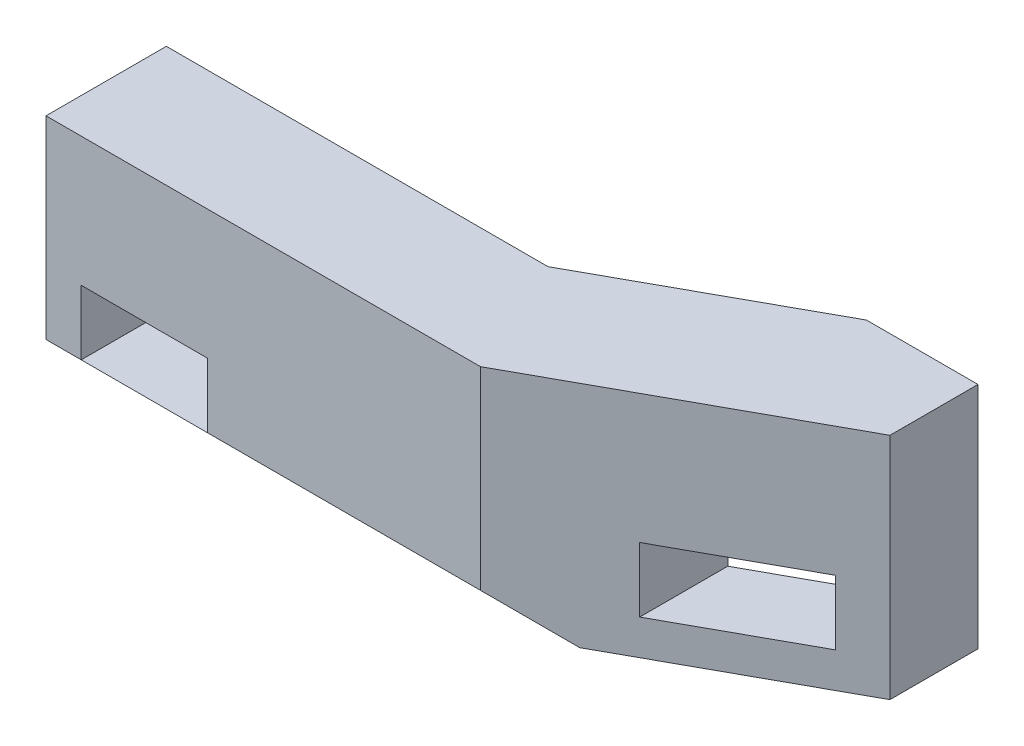
ISO-10303-21;
HEADER;
FILE_DESCRIPTION(('STEP AP214'),'2;1');
FILE_NAME('part.step','',(''),(''),'','','');
FILE_SCHEMA(('AUTOMOTIVE_DESIGN { 1 0 10303 214 1 1 1 1 }'));
ENDSEC;
DATA;
#1=APPLICATION_CONTEXT('core data for automotive mechanical design processes');
#2=APPLICATION_PROTOCOL_DEFINITION('international standard','automotive_design',2000,#1);
#3=PRODUCT_CONTEXT('',#1,'mechanical');
#4=PRODUCT('Part','Part','',(#3));
#5=PRODUCT_RELATED_PRODUCT_CATEGORY('part','',(#4));
#6=PRODUCT_DEFINITION_FORMATION('','',#4);
#7=PRODUCT_DEFINITION_CONTEXT('part definition',#1,'design');
#8=PRODUCT_DEFINITION('design','',#6,#7);
#9=PRODUCT_DEFINITION_SHAPE('','',#8);
#10=(LENGTH_UNIT() NAMED_UNIT(*) SI_UNIT(.MILLI.,.METRE.));
#11=(NAMED_UNIT(*) PLANE_ANGLE_UNIT() SI_UNIT($,.RADIAN.));
#12=(NAMED_UNIT(*) SI_UNIT($,.STERADIAN.) SOLID_ANGLE_UNIT());
#13=UNCERTAINTY_MEASURE_WITH_UNIT(LENGTH_MEASURE(1.E-05),#10,'distance_accuracy_value','');
#14=(GEOMETRIC_REPRESENTATION_CONTEXT(3) GLOBAL_UNCERTAINTY_ASSIGNED_CONTEXT((#13)) GLOBAL_UNIT_ASSIGNED_CONTEXT((#10,
#11,#12)) REPRESENTATION_CONTEXT('',''));
#15=CARTESIAN_POINT('',(0.,0.,0.));
#16=DIRECTION('',(0.,0.,1.));
#17=DIRECTION('',(1.,0.,0.));
#18=AXIS2_PLACEMENT_3D('',#15,#16,#17);
#19=CARTESIAN_POINT('',(0.,3.9,-5.89906103286385));
#20=DIRECTION('',(0.,0.,-1.));
#21=DIRECTION('',(-1.,0.,0.));
#22=AXIS2_PLACEMENT_3D('',#19,#20,#21);
#23=PLANE('',#22);
#24=DIRECTION('',(1.,0.,0.));
#25=VECTOR('',#24,1.);
#26=CARTESIAN_POINT('',(13.4996205473604,2.7,-5.89906103286385));
#27=LINE('',#26,#25);
#28=CARTESIAN_POINT('',(13.4996205473604,2.7,-5.89906103286385));
#29=VERTEX_POINT('',#28);
#30=CARTESIAN_POINT('',(17.3,2.7,-5.89906103286385));
#31=VERTEX_POINT('',#30);
#32=EDGE_CURVE('E233',#29,#31,#27,.T.);
#33=ORIENTED_EDGE('',*,*,#32,.F.);
#34=DIRECTION('',(0.,-1.,0.));
#35=VECTOR('',#34,1.);
#36=CARTESIAN_POINT('',(13.4996205473604,3.9,-5.89906103286385));
#37=LINE('',#36,#35);
#38=CARTESIAN_POINT('',(13.4996205473604,3.9,-5.89906103286385));
#39=VERTEX_POINT('',#38);
#40=EDGE_CURVE('E316',#39,#29,#37,.T.);
#41=ORIENTED_EDGE('',*,*,#40,.F.);
#42=DIRECTION('',(1.,0.,0.));
#43=VECTOR('',#42,1.);
#44=CARTESIAN_POINT('',(0.,3.9,-5.89906103286385));
#45=LINE('',#44,#43);
#46=CARTESIAN_POINT('',(17.3,3.9,-5.89906103286385));
#47=VERTEX_POINT('',#46);
#48=EDGE_CURVE('E255',#39,#47,#45,.T.);
#49=ORIENTED_EDGE('',*,*,#48,.T.);
#50=DIRECTION('',(0.,-1.,0.));
#51=VECTOR('',#50,1.);
#52=CARTESIAN_POINT('',(17.3,3.9,-5.89906103286385));
#53=LINE('',#52,#51);
#54=EDGE_CURVE('E281',#47,#31,#53,.T.);
#55=ORIENTED_EDGE('',*,*,#54,.T.);
#56=EDGE_LOOP('',(#33,#41,#49,#55));
#57=FACE_BOUND('',#56,.T.);
#58=ADVANCED_FACE('F47',(#57),#23,.T.);
#59=CARTESIAN_POINT('',(0.643602183385777,3.9,1.17040780301716));
#60=DIRECTION('',(-0.481848560622123,0.,-0.876254509047678));
#61=DIRECTION('',(-0.876254509047679,0.,0.481848560622123));
#62=AXIS2_PLACEMENT_3D('',#59,#60,#61);
#63=PLANE('',#62);
#64=DIRECTION('',(0.876254509047678,0.,-0.481848560622123));
#65=VECTOR('',#64,1.);
#66=CARTESIAN_POINT('',(6.5,2.7,-2.05));
#67=LINE('',#66,#65);
#68=CARTESIAN_POINT('',(6.5,2.7,-2.05));
#69=VERTEX_POINT('',#68);
#70=EDGE_CURVE('E238',#69,#29,#67,.T.);
#71=ORIENTED_EDGE('',*,*,#70,.F.);
#72=DIRECTION('',(0.,-1.,0.));
#73=VECTOR('',#72,1.);
#74=CARTESIAN_POINT('',(6.5,3.9,-2.05));
#75=LINE('',#74,#73);
#76=CARTESIAN_POINT('',(6.5,3.9,-2.05));
#77=VERTEX_POINT('',#76);
#78=EDGE_CURVE('E312',#77,#69,#75,.T.);
#79=ORIENTED_EDGE('',*,*,#78,.F.);
#80=DIRECTION('',(0.876254509047678,0.,-0.481848560622123));
#81=VECTOR('',#80,1.);
#82=CARTESIAN_POINT('',(0.643602183385777,3.9,1.17040780301716));
#83=LINE('',#82,#81);
#84=EDGE_CURVE('E259',#77,#39,#83,.T.);
#85=ORIENTED_EDGE('',*,*,#84,.T.);
#86=ORIENTED_EDGE('',*,*,#40,.T.);
#87=EDGE_LOOP('',(#71,#79,#85,#86));
#88=FACE_BOUND('',#87,.T.);
#89=ADVANCED_FACE('F429',(#88),#63,.T.);
#90=CARTESIAN_POINT('',(0.,3.9,-2.05));
#91=DIRECTION('',(0.,0.,-1.));
#92=DIRECTION('',(-1.,0.,0.));
#93=AXIS2_PLACEMENT_3D('',#90,#91,#92);
#94=PLANE('',#93);
#95=DIRECTION('',(0.,-1.,0.));
#96=VECTOR('',#95,1.);
#97=CARTESIAN_POINT('',(-0.999999999999999,3.9,-2.05));
#98=LINE('',#97,#96);
#99=CARTESIAN_POINT('',(-0.999999999999998,-0.5,-2.05));
#100=VERTEX_POINT('',#99);
#101=CARTESIAN_POINT('',(-0.999999999999998,-2.7,-2.05));
#102=VERTEX_POINT('',#101);
#103=EDGE_CURVE('E219',#100,#102,#98,.T.);
#104=ORIENTED_EDGE('',*,*,#103,.F.);
#105=DIRECTION('',(1.,0.,0.));
#106=VECTOR('',#105,1.);
#107=CARTESIAN_POINT('',(0.,-0.5,-2.05));
#108=LINE('',#107,#106);
#109=CARTESIAN_POINT('',(-5.3,-0.5,-2.05));
#110=VERTEX_POINT('',#109);
#111=EDGE_CURVE('E209',#110,#100,#108,.T.);
#112=ORIENTED_EDGE('',*,*,#111,.F.);
#113=DIRECTION('',(0.,1.,0.));
#114=VECTOR('',#113,1.);
#115=CARTESIAN_POINT('',(-5.3,3.9,-2.05));
#116=LINE('',#115,#114);
#117=CARTESIAN_POINT('',(-5.3,-2.7,-2.05));
#118=VERTEX_POINT('',#117);
#119=EDGE_CURVE('E212',#118,#110,#116,.T.);
#120=ORIENTED_EDGE('',*,*,#119,.F.);
#121=DIRECTION('',(-1.,0.,0.));
#122=VECTOR('',#121,1.);
#123=CARTESIAN_POINT('',(0.,-2.7,-2.05));
#124=LINE('',#123,#122);
#125=EDGE_CURVE('E216',#102,#118,#124,.T.);
#126=ORIENTED_EDGE('',*,*,#125,.F.);
#127=EDGE_LOOP('',(#104,#112,#120,#126));
#128=FACE_BOUND('',#127,.T.);
#129=DIRECTION('',(1.,0.,0.));
#130=VECTOR('',#129,1.);
#131=CARTESIAN_POINT('',(0.,-3.9,-2.05));
#132=LINE('',#131,#130);
#133=CARTESIAN_POINT('',(-6.5,-3.9,-2.05));
#134=VERTEX_POINT('',#133);
#135=CARTESIAN_POINT('',(6.5,-3.9,-2.05));
#136=VERTEX_POINT('',#135);
#137=EDGE_CURVE('E254',#134,#136,#132,.T.);
#138=ORIENTED_EDGE('',*,*,#137,.F.);
#139=DIRECTION('',(0.,-1.,0.));
#140=VECTOR('',#139,1.);
#141=CARTESIAN_POINT('',(-6.5,3.9,-2.05));
#142=LINE('',#141,#140);
#143=CARTESIAN_POINT('',(-6.5,3.9,-2.05));
#144=VERTEX_POINT('',#143);
#145=EDGE_CURVE('E308',#144,#134,#142,.T.);
#146=ORIENTED_EDGE('',*,*,#145,.F.);
#147=DIRECTION('',(1.,0.,0.));
#148=VECTOR('',#147,1.);
#149=CARTESIAN_POINT('',(0.,3.9,-2.05));
#150=LINE('',#149,#148);
#151=EDGE_CURVE('E264',#144,#77,#150,.T.);
#152=ORIENTED_EDGE('',*,*,#151,.T.);
#153=ORIENTED_EDGE('',*,*,#78,.T.);
#154=DIRECTION('',(0.,-1.,0.));
#155=VECTOR('',#154,1.);
#156=CARTESIAN_POINT('',(6.5,15.7799497097846,-2.05));
#157=LINE('',#156,#155);
#158=EDGE_CURVE('E241',#69,#136,#157,.T.);
#159=ORIENTED_EDGE('',*,*,#158,.T.);
#160=EDGE_LOOP('',(#138,#146,#152,#153,#159));
#161=FACE_BOUND('',#160,.T.);
#162=ADVANCED_FACE('F422',(#128,#161),#94,.T.);
#163=CARTESIAN_POINT('',(-6.5,3.9,0.));
#164=DIRECTION('',(-1.,0.,0.));
#165=DIRECTION('',(0.,0.,1.));
#166=AXIS2_PLACEMENT_3D('',#163,#164,#165);
#167=PLANE('',#166);
#168=DIRECTION('',(0.,0.,-1.));
#169=VECTOR('',#168,1.);
#170=CARTESIAN_POINT('',(-6.5,-3.9,0.));
#171=LINE('',#170,#169);
#172=CARTESIAN_POINT('',(-6.5,-3.9,0.849999999999993));
#173=VERTEX_POINT('',#172);
#174=EDGE_CURVE('E285',#173,#134,#171,.T.);
#175=ORIENTED_EDGE('',*,*,#174,.F.);
#176=DIRECTION('',(0.,-0.707106781186547,-0.707106781186549));
#177=VECTOR('',#176,1.);
#178=CARTESIAN_POINT('',(-6.5,-0.425000000000008,4.325));
#179=LINE('',#178,#177);
#180=CARTESIAN_POINT('',(-6.5,-2.7,2.05));
#181=VERTEX_POINT('',#180);
#182=EDGE_CURVE('E12',#173,#181,#179,.F.);
#183=ORIENTED_EDGE('',*,*,#182,.T.);
#184=DIRECTION('',(0.,-1.,0.));
#185=VECTOR('',#184,1.);
#186=CARTESIAN_POINT('',(-6.5,3.9,2.05));
#187=LINE('',#186,#185);
#188=CARTESIAN_POINT('',(-6.5,3.9,2.05));
#189=VERTEX_POINT('',#188);
#190=EDGE_CURVE('E304',#189,#181,#187,.T.);
#191=ORIENTED_EDGE('',*,*,#190,.F.);
#192=DIRECTION('',(0.,0.,-1.));
#193=VECTOR('',#192,1.);
#194=CARTESIAN_POINT('',(-6.5,3.9,0.));
#195=LINE('',#194,#193);
#196=EDGE_CURVE('E268',#189,#144,#195,.T.);
#197=ORIENTED_EDGE('',*,*,#196,.T.);
#198=ORIENTED_EDGE('',*,*,#145,.T.);
#199=EDGE_LOOP('',(#175,#183,#191,#197,#198));
#200=FACE_BOUND('',#199,.T.);
#201=ADVANCED_FACE('F419',(#200),#167,.T.);
#202=CARTESIAN_POINT('',(0.,3.9,2.05));
#203=DIRECTION('',(0.,0.,-1.));
#204=DIRECTION('',(-1.,0.,0.));
#205=AXIS2_PLACEMENT_3D('',#202,#203,#204);
#206=PLANE('',#205);
#207=ORIENTED_EDGE('',*,*,#190,.T.);
#208=DIRECTION('',(1.,0.,0.));
#209=VECTOR('',#208,1.);
#210=CARTESIAN_POINT('',(0.,-2.7,2.05));
#211=LINE('',#210,#209);
#212=CARTESIAN_POINT('',(-5.3,-2.7,2.05));
#213=VERTEX_POINT('',#212);
#214=EDGE_CURVE('E351',#181,#213,#211,.T.);
#215=ORIENTED_EDGE('',*,*,#214,.T.);
#216=DIRECTION('',(0.,1.,0.));
#217=VECTOR('',#216,1.);
#218=CARTESIAN_POINT('',(-5.3,3.9,2.05));
#219=LINE('',#218,#217);
#220=CARTESIAN_POINT('',(-5.3,-0.5,2.05));
#221=VERTEX_POINT('',#220);
#222=EDGE_CURVE('E337',#213,#221,#219,.T.);
#223=ORIENTED_EDGE('',*,*,#222,.T.);
#224=DIRECTION('',(1.,0.,0.));
#225=VECTOR('',#224,1.);
#226=CARTESIAN_POINT('',(0.,-0.5,2.05));
#227=LINE('',#226,#225);
#228=CARTESIAN_POINT('',(-0.999999999999998,-0.5,2.05));
#229=VERTEX_POINT('',#228);
#230=EDGE_CURVE('E333',#221,#229,#227,.T.);
#231=ORIENTED_EDGE('',*,*,#230,.T.);
#232=DIRECTION('',(0.,-1.,0.));
#233=VECTOR('',#232,1.);
#234=CARTESIAN_POINT('',(-0.999999999999999,3.9,2.05));
#235=LINE('',#234,#233);
#236=CARTESIAN_POINT('',(-0.999999999999998,-2.7,2.05));
#237=VERTEX_POINT('',#236);
#238=EDGE_CURVE('E344',#229,#237,#235,.T.);
#239=ORIENTED_EDGE('',*,*,#238,.T.);
#240=DIRECTION('',(1.,0.,0.));
#241=VECTOR('',#240,1.);
#242=CARTESIAN_POINT('',(0.,-2.7,2.05));
#243=LINE('',#242,#241);
#244=CARTESIAN_POINT('',(8.3,-2.7,2.05));
#245=VERTEX_POINT('',#244);
#246=EDGE_CURVE('E348',#237,#245,#243,.T.);
#247=ORIENTED_EDGE('',*,*,#246,.T.);
#248=DIRECTION('',(0.,-1.,0.));
#249=VECTOR('',#248,1.);
#250=CARTESIAN_POINT('',(8.3,3.9,2.05));
#251=LINE('',#250,#249);
#252=CARTESIAN_POINT('',(8.3,3.9,2.05));
#253=VERTEX_POINT('',#252);
#254=EDGE_CURVE('E301',#253,#245,#251,.T.);
#255=ORIENTED_EDGE('',*,*,#254,.F.);
#256=DIRECTION('',(1.,0.,0.));
#257=VECTOR('',#256,1.);
#258=CARTESIAN_POINT('',(0.,3.9,2.05));
#259=LINE('',#258,#257);
#260=EDGE_CURVE('E272',#189,#253,#259,.T.);
#261=ORIENTED_EDGE('',*,*,#260,.F.);
#262=EDGE_LOOP('',(#207,#215,#223,#231,#239,#247,#255,#261));
#263=FACE_BOUND('',#262,.T.);
#264=ADVANCED_FACE('F360',(#263),#206,.F.);
#265=CARTESIAN_POINT('',(2.79263274014368,3.9,5.07847741104723));
#266=DIRECTION('',(-0.481848560622123,0.,-0.876254509047678));
#267=DIRECTION('',(-0.876254509047679,0.,0.481848560622123));
#268=AXIS2_PLACEMENT_3D('',#265,#266,#267);
#269=PLANE('',#268);
#270=DIRECTION('',(0.876254509047679,0.,-0.481848560622123));
#271=VECTOR('',#270,1.);
#272=CARTESIAN_POINT('',(2.79263274014368,-0.5,5.07847741104723));
#273=LINE('',#272,#271);
#274=CARTESIAN_POINT('',(11.8,-0.5,0.125365153886278));
#275=VERTEX_POINT('',#274);
#276=CARTESIAN_POINT('',(16.1,-0.5,-2.239186228482));
#277=VERTEX_POINT('',#276);
#278=EDGE_CURVE('E172',#275,#277,#273,.T.);
#279=ORIENTED_EDGE('',*,*,#278,.T.);
#280=DIRECTION('',(0.,-1.,0.));
#281=VECTOR('',#280,1.);
#282=CARTESIAN_POINT('',(16.1,3.9,-2.239186228482));
#283=LINE('',#282,#281);
#284=CARTESIAN_POINT('',(16.1,-2.7,-2.23918622848201));
#285=VERTEX_POINT('',#284);
#286=EDGE_CURVE('E203',#277,#285,#283,.T.);
#287=ORIENTED_EDGE('',*,*,#286,.T.);
#288=DIRECTION('',(-0.876254509047679,0.,0.481848560622123));
#289=VECTOR('',#288,1.);
#290=CARTESIAN_POINT('',(2.79263274014368,-2.7,5.07847741104723));
#291=LINE('',#290,#289);
#292=CARTESIAN_POINT('',(11.8,-2.7,0.125365153886281));
#293=VERTEX_POINT('',#292);
#294=EDGE_CURVE('E199',#285,#293,#291,.T.);
#295=ORIENTED_EDGE('',*,*,#294,.T.);
#296=DIRECTION('',(0.,1.,0.));
#297=VECTOR('',#296,1.);
#298=CARTESIAN_POINT('',(11.8,3.9,0.125365153886281));
#299=LINE('',#298,#297);
#300=EDGE_CURVE('E184',#293,#275,#299,.T.);
#301=ORIENTED_EDGE('',*,*,#300,.T.);
#302=EDGE_LOOP('',(#279,#287,#295,#301));
#303=FACE_BOUND('',#302,.T.);
#304=ORIENTED_EDGE('',*,*,#254,.T.);
#305=DIRECTION('',(-0.789393478794799,0.434084056166685,0.434084056166686));
#306=VECTOR('',#305,1.);
#307=CARTESIAN_POINT('',(3.12792086578083,0.144103922450248,4.89410392245025));
#308=LINE('',#307,#306);
#309=CARTESIAN_POINT('',(10.4822321301523,-3.9,0.849999999999993));
#310=VERTEX_POINT('',#309);
#311=EDGE_CURVE('E71',#245,#310,#308,.F.);
#312=ORIENTED_EDGE('',*,*,#311,.T.);
#313=DIRECTION('',(0.876254509047678,0.,-0.481848560622123));
#314=VECTOR('',#313,1.);
#315=CARTESIAN_POINT('',(2.79263274014368,-3.9,5.07847741104723));
#316=LINE('',#315,#314);
#317=CARTESIAN_POINT('',(17.3,-3.9,-2.89906103286385));
#318=VERTEX_POINT('',#317);
#319=EDGE_CURVE('E288',#310,#318,#316,.T.);
#320=ORIENTED_EDGE('',*,*,#319,.T.);
#321=DIRECTION('',(0.,-1.,0.));
#322=VECTOR('',#321,1.);
#323=CARTESIAN_POINT('',(17.3,3.9,-2.89906103286385));
#324=LINE('',#323,#322);
#325=CARTESIAN_POINT('',(17.3,3.9,-2.89906103286385));
#326=VERTEX_POINT('',#325);
#327=EDGE_CURVE('E297',#326,#318,#324,.T.);
#328=ORIENTED_EDGE('',*,*,#327,.F.);
#329=DIRECTION('',(0.876254509047678,0.,-0.481848560622123));
#330=VECTOR('',#329,1.);
#331=CARTESIAN_POINT('',(2.79263274014368,3.9,5.07847741104723));
#332=LINE('',#331,#330);
#333=EDGE_CURVE('E275',#253,#326,#332,.T.);
#334=ORIENTED_EDGE('',*,*,#333,.F.);
#335=EDGE_LOOP('',(#304,#312,#320,#328,#334));
#336=FACE_BOUND('',#335,.T.);
#337=ADVANCED_FACE('F198',(#303,#336),#269,.F.);
#338=CARTESIAN_POINT('',(17.3,3.9,0.));
#339=DIRECTION('',(-1.,0.,0.));
#340=DIRECTION('',(0.,0.,1.));
#341=AXIS2_PLACEMENT_3D('',#338,#339,#340);
#342=PLANE('',#341);
#343=DIRECTION('',(0.,0.,-1.));
#344=VECTOR('',#343,1.);
#345=CARTESIAN_POINT('',(17.3,-3.9,0.));
#346=LINE('',#345,#344);
#347=CARTESIAN_POINT('',(17.3,-3.9,-5.89906103286385));
#348=VERTEX_POINT('',#347);
#349=EDGE_CURVE('E260',#318,#348,#346,.T.);
#350=ORIENTED_EDGE('',*,*,#349,.T.);
#351=DIRECTION('',(0.,-1.,0.));
#352=VECTOR('',#351,1.);
#353=CARTESIAN_POINT('',(17.3,15.7799497097846,-5.89906103286385));
#354=LINE('',#353,#352);
#355=EDGE_CURVE('E237',#31,#348,#354,.T.);
#356=ORIENTED_EDGE('',*,*,#355,.F.);
#357=ORIENTED_EDGE('',*,*,#54,.F.);
#358=DIRECTION('',(0.,0.,-1.));
#359=VECTOR('',#358,1.);
#360=CARTESIAN_POINT('',(17.3,3.9,0.));
#361=LINE('',#360,#359);
#362=EDGE_CURVE('E278',#326,#47,#361,.T.);
#363=ORIENTED_EDGE('',*,*,#362,.F.);
#364=ORIENTED_EDGE('',*,*,#327,.T.);
#365=EDGE_LOOP('',(#350,#356,#357,#363,#364));
#366=FACE_BOUND('',#365,.T.);
#367=ADVANCED_FACE('F413',(#366),#342,.F.);
#368=CARTESIAN_POINT('',(0.,3.9,0.));
#369=DIRECTION('',(0.,1.,0.));
#370=DIRECTION('',(0.,0.,1.));
#371=AXIS2_PLACEMENT_3D('',#368,#369,#370);
#372=PLANE('',#371);
#373=ORIENTED_EDGE('',*,*,#48,.F.);
#374=ORIENTED_EDGE('',*,*,#84,.F.);
#375=ORIENTED_EDGE('',*,*,#151,.F.);
#376=ORIENTED_EDGE('',*,*,#196,.F.);
#377=ORIENTED_EDGE('',*,*,#260,.T.);
#378=ORIENTED_EDGE('',*,*,#333,.T.);
#379=ORIENTED_EDGE('',*,*,#362,.T.);
#380=EDGE_LOOP('',(#373,#374,#375,#376,#377,#378,#379));
#381=FACE_BOUND('',#380,.T.);
#382=ADVANCED_FACE('F434',(#381),#372,.T.);
#383=CARTESIAN_POINT('',(0.,-3.9,0.));
#384=DIRECTION('',(0.,1.,0.));
#385=DIRECTION('',(0.,0.,1.));
#386=AXIS2_PLACEMENT_3D('',#383,#384,#385);
#387=PLANE('',#386);
#388=ORIENTED_EDGE('',*,*,#319,.F.);
#389=DIRECTION('',(-1.,0.,0.));
#390=VECTOR('',#389,1.);
#391=CARTESIAN_POINT('',(0.,-3.9,0.849999999999993));
#392=LINE('',#391,#390);
#393=EDGE_CURVE('E57',#310,#173,#392,.T.);
#394=ORIENTED_EDGE('',*,*,#393,.T.);
#395=ORIENTED_EDGE('',*,*,#174,.T.);
#396=ORIENTED_EDGE('',*,*,#137,.T.);
#397=DIRECTION('',(-0.85328183365196,0.,-0.521450009453974));
#398=VECTOR('',#397,1.);
#399=CARTESIAN_POINT('',(8.3,-3.9,-0.950000000000005));
#400=LINE('',#399,#398);
#401=CARTESIAN_POINT('',(8.3,-3.9,-0.950000000000006));
#402=VERTEX_POINT('',#401);
#403=EDGE_CURVE('E223',#402,#136,#400,.T.);
#404=ORIENTED_EDGE('',*,*,#403,.F.);
#405=DIRECTION('',(-0.876254509047679,0.,0.481848560622123));
#406=VECTOR('',#405,1.);
#407=CARTESIAN_POINT('',(17.3,-3.9,-5.89906103286385));
#408=LINE('',#407,#406);
#409=EDGE_CURVE('E222',#348,#402,#408,.T.);
#410=ORIENTED_EDGE('',*,*,#409,.F.);
#411=ORIENTED_EDGE('',*,*,#349,.F.);
#412=EDGE_LOOP('',(#388,#394,#395,#396,#404,#410,#411));
#413=FACE_BOUND('',#412,.T.);
#414=ADVANCED_FACE('F412',(#413),#387,.F.);
#415=CARTESIAN_POINT('',(0.,2.7,0.));
#416=DIRECTION('',(0.,1.,0.));
#417=DIRECTION('',(0.,0.,1.));
#418=AXIS2_PLACEMENT_3D('',#415,#416,#417);
#419=PLANE('',#418);
#420=ORIENTED_EDGE('',*,*,#32,.T.);
#421=DIRECTION('',(-0.876254509047679,0.,0.481848560622123));
#422=VECTOR('',#421,1.);
#423=CARTESIAN_POINT('',(17.3,2.7,-5.89906103286385));
#424=LINE('',#423,#422);
#425=CARTESIAN_POINT('',(8.3,2.7,-0.950000000000005));
#426=VERTEX_POINT('',#425);
#427=EDGE_CURVE('E226',#31,#426,#424,.T.);
#428=ORIENTED_EDGE('',*,*,#427,.T.);
#429=DIRECTION('',(-0.85328183365196,0.,-0.521450009453974));
#430=VECTOR('',#429,1.);
#431=CARTESIAN_POINT('',(8.3,2.7,-0.950000000000005));
#432=LINE('',#431,#430);
#433=EDGE_CURVE('E242',#426,#69,#432,.T.);
#434=ORIENTED_EDGE('',*,*,#433,.T.);
#435=ORIENTED_EDGE('',*,*,#70,.T.);
#436=EDGE_LOOP('',(#420,#428,#434,#435));
#437=FACE_BOUND('',#436,.T.);
#438=ADVANCED_FACE('F403',(#437),#419,.F.);
#439=CARTESIAN_POINT('',(17.3,15.7799497097846,-5.89906103286385));
#440=DIRECTION('',(0.481848560622123,0.,0.876254509047678));
#441=DIRECTION('',(0.876254509047679,0.,-0.481848560622123));
#442=AXIS2_PLACEMENT_3D('',#439,#440,#441);
#443=PLANE('',#442);
#444=DIRECTION('',(0.876254509047679,0.,-0.481848560622123));
#445=VECTOR('',#444,1.);
#446=CARTESIAN_POINT('',(17.3,-2.7,-5.89906103286385));
#447=LINE('',#446,#445);
#448=CARTESIAN_POINT('',(11.8,-2.7,-2.87463484611372));
#449=VERTEX_POINT('',#448);
#450=CARTESIAN_POINT('',(16.1,-2.7,-5.239186228482));
#451=VERTEX_POINT('',#450);
#452=EDGE_CURVE('E325',#449,#451,#447,.T.);
#453=ORIENTED_EDGE('',*,*,#452,.T.);
#454=DIRECTION('',(0.,1.,0.));
#455=VECTOR('',#454,1.);
#456=CARTESIAN_POINT('',(16.1,15.7799497097846,-5.239186228482));
#457=LINE('',#456,#455);
#458=CARTESIAN_POINT('',(16.1,-0.5,-5.239186228482));
#459=VERTEX_POINT('',#458);
#460=EDGE_CURVE('E329',#451,#459,#457,.T.);
#461=ORIENTED_EDGE('',*,*,#460,.T.);
#462=DIRECTION('',(-0.876254509047679,0.,0.481848560622123));
#463=VECTOR('',#462,1.);
#464=CARTESIAN_POINT('',(17.3,-0.5,-5.89906103286385));
#465=LINE('',#464,#463);
#466=CARTESIAN_POINT('',(11.8,-0.5,-2.87463484611372));
#467=VERTEX_POINT('',#466);
#468=EDGE_CURVE('E320',#459,#467,#465,.T.);
#469=ORIENTED_EDGE('',*,*,#468,.T.);
#470=DIRECTION('',(0.,-1.,0.));
#471=VECTOR('',#470,1.);
#472=CARTESIAN_POINT('',(11.8,15.7799497097846,-2.87463484611372));
#473=LINE('',#472,#471);
#474=EDGE_CURVE('E192',#467,#449,#473,.T.);
#475=ORIENTED_EDGE('',*,*,#474,.T.);
#476=EDGE_LOOP('',(#453,#461,#469,#475));
#477=FACE_BOUND('',#476,.T.);
#478=ORIENTED_EDGE('',*,*,#355,.T.);
#479=ORIENTED_EDGE('',*,*,#409,.T.);
#480=DIRECTION('',(0.,-1.,0.));
#481=VECTOR('',#480,1.);
#482=CARTESIAN_POINT('',(8.3,15.7799497097846,-0.950000000000005));
#483=LINE('',#482,#481);
#484=EDGE_CURVE('E232',#426,#402,#483,.T.);
#485=ORIENTED_EDGE('',*,*,#484,.F.);
#486=ORIENTED_EDGE('',*,*,#427,.F.);
#487=EDGE_LOOP('',(#478,#479,#485,#486));
#488=FACE_BOUND('',#487,.T.);
#489=ADVANCED_FACE('F399',(#477,#488),#443,.F.);
#490=CARTESIAN_POINT('',(8.3,15.7799497097846,-0.950000000000005));
#491=DIRECTION('',(-0.521450009453974,0.,0.85328183365196));
#492=DIRECTION('',(0.85328183365196,0.,0.521450009453974));
#493=AXIS2_PLACEMENT_3D('',#490,#491,#492);
#494=PLANE('',#493);
#495=ORIENTED_EDGE('',*,*,#484,.T.);
#496=ORIENTED_EDGE('',*,*,#403,.T.);
#497=ORIENTED_EDGE('',*,*,#158,.F.);
#498=ORIENTED_EDGE('',*,*,#433,.F.);
#499=EDGE_LOOP('',(#495,#496,#497,#498));
#500=FACE_BOUND('',#499,.T.);
#501=ADVANCED_FACE('F402',(#500),#494,.F.);
#502=CARTESIAN_POINT('',(16.1,-0.5,-5.89906103286385));
#503=DIRECTION('',(1.,0.,0.));
#504=DIRECTION('',(0.,0.,-1.));
#505=AXIS2_PLACEMENT_3D('',#502,#503,#504);
#506=PLANE('',#505);
#507=DIRECTION('',(0.,0.,1.));
#508=VECTOR('',#507,1.);
#509=CARTESIAN_POINT('',(16.1,-0.5,-5.89906103286385));
#510=LINE('',#509,#508);
#511=EDGE_CURVE('E178',#459,#277,#510,.T.);
#512=ORIENTED_EDGE('',*,*,#511,.F.);
#513=ORIENTED_EDGE('',*,*,#460,.F.);
#514=DIRECTION('',(0.,0.,1.));
#515=VECTOR('',#514,1.);
#516=CARTESIAN_POINT('',(16.1,-2.7,-5.89906103286385));
#517=LINE('',#516,#515);
#518=EDGE_CURVE('E390',#451,#285,#517,.T.);
#519=ORIENTED_EDGE('',*,*,#518,.T.);
#520=ORIENTED_EDGE('',*,*,#286,.F.);
#521=EDGE_LOOP('',(#512,#513,#519,#520));
#522=FACE_BOUND('',#521,.T.);
#523=ADVANCED_FACE('F395',(#522),#506,.F.);
#524=CARTESIAN_POINT('',(11.8,-2.7,-5.89906103286385));
#525=DIRECTION('',(0.,-1.,0.));
#526=DIRECTION('',(0.,0.,-1.));
#527=AXIS2_PLACEMENT_3D('',#524,#525,#526);
#528=PLANE('',#527);
#529=ORIENTED_EDGE('',*,*,#518,.F.);
#530=ORIENTED_EDGE('',*,*,#452,.F.);
#531=DIRECTION('',(0.,0.,1.));
#532=VECTOR('',#531,1.);
#533=CARTESIAN_POINT('',(11.8,-2.7,-5.89906103286385));
#534=LINE('',#533,#532);
#535=EDGE_CURVE('E195',#449,#293,#534,.T.);
#536=ORIENTED_EDGE('',*,*,#535,.T.);
#537=ORIENTED_EDGE('',*,*,#294,.F.);
#538=EDGE_LOOP('',(#529,#530,#536,#537));
#539=FACE_BOUND('',#538,.T.);
#540=ADVANCED_FACE('F397',(#539),#528,.F.);
#541=CARTESIAN_POINT('',(11.8,-0.5,-5.89906103286385));
#542=DIRECTION('',(-1.,0.,0.));
#543=DIRECTION('',(0.,0.,1.));
#544=AXIS2_PLACEMENT_3D('',#541,#542,#543);
#545=PLANE('',#544);
#546=ORIENTED_EDGE('',*,*,#535,.F.);
#547=ORIENTED_EDGE('',*,*,#474,.F.);
#548=DIRECTION('',(0.,0.,1.));
#549=VECTOR('',#548,1.);
#550=CARTESIAN_POINT('',(11.8,-0.5,-5.89906103286385));
#551=LINE('',#550,#549);
#552=EDGE_CURVE('E175',#467,#275,#551,.T.);
#553=ORIENTED_EDGE('',*,*,#552,.T.);
#554=ORIENTED_EDGE('',*,*,#300,.F.);
#555=EDGE_LOOP('',(#546,#547,#553,#554));
#556=FACE_BOUND('',#555,.T.);
#557=ADVANCED_FACE('F189',(#556),#545,.F.);
#558=CARTESIAN_POINT('',(11.8,-0.5,-5.89906103286385));
#559=DIRECTION('',(0.,1.,0.));
#560=DIRECTION('',(0.,0.,1.));
#561=AXIS2_PLACEMENT_3D('',#558,#559,#560);
#562=PLANE('',#561);
#563=ORIENTED_EDGE('',*,*,#552,.F.);
#564=ORIENTED_EDGE('',*,*,#468,.F.);
#565=ORIENTED_EDGE('',*,*,#511,.T.);
#566=ORIENTED_EDGE('',*,*,#278,.F.);
#567=EDGE_LOOP('',(#563,#564,#565,#566));
#568=FACE_BOUND('',#567,.T.);
#569=ADVANCED_FACE('F174',(#568),#562,.F.);
#570=CARTESIAN_POINT('',(-0.999999999999998,-0.5,-5.89906103286385));
#571=DIRECTION('',(1.,0.,0.));
#572=DIRECTION('',(0.,1.,0.));
#573=AXIS2_PLACEMENT_3D('',#570,#571,#572);
#574=PLANE('',#573);
#575=ORIENTED_EDGE('',*,*,#103,.T.);
#576=DIRECTION('',(0.,0.,1.));
#577=VECTOR('',#576,1.);
#578=CARTESIAN_POINT('',(-0.999999999999998,-2.7,-5.89906103286385));
#579=LINE('',#578,#577);
#580=EDGE_CURVE('E185',#102,#237,#579,.T.);
#581=ORIENTED_EDGE('',*,*,#580,.T.);
#582=ORIENTED_EDGE('',*,*,#238,.F.);
#583=DIRECTION('',(0.,0.,1.));
#584=VECTOR('',#583,1.);
#585=CARTESIAN_POINT('',(-0.999999999999998,-0.5,-5.89906103286385));
#586=LINE('',#585,#584);
#587=EDGE_CURVE('E382',#100,#229,#586,.T.);
#588=ORIENTED_EDGE('',*,*,#587,.F.);
#589=EDGE_LOOP('',(#575,#581,#582,#588));
#590=FACE_BOUND('',#589,.T.);
#591=ADVANCED_FACE('F440',(#590),#574,.F.);
#592=CARTESIAN_POINT('',(-5.3,-2.7,-5.89906103286385));
#593=DIRECTION('',(0.,-1.,0.));
#594=DIRECTION('',(0.,0.,-1.));
#595=AXIS2_PLACEMENT_3D('',#592,#593,#594);
#596=PLANE('',#595);
#597=ORIENTED_EDGE('',*,*,#125,.T.);
#598=DIRECTION('',(0.,0.,1.));
#599=VECTOR('',#598,1.);
#600=CARTESIAN_POINT('',(-5.3,-2.7,-5.89906103286385));
#601=LINE('',#600,#599);
#602=EDGE_CURVE('E369',#118,#213,#601,.T.);
#603=ORIENTED_EDGE('',*,*,#602,.T.);
#604=DIRECTION('',(-1.,0.,0.));
#605=VECTOR('',#604,1.);
#606=CARTESIAN_POINT('',(0.,-2.7,2.05));
#607=LINE('',#606,#605);
#608=EDGE_CURVE('E341',#237,#213,#607,.T.);
#609=ORIENTED_EDGE('',*,*,#608,.F.);
#610=ORIENTED_EDGE('',*,*,#580,.F.);
#611=EDGE_LOOP('',(#597,#603,#609,#610));
#612=FACE_BOUND('',#611,.T.);
#613=ADVANCED_FACE('F373',(#612),#596,.F.);
#614=CARTESIAN_POINT('',(-5.3,-0.5,-5.89906103286385));
#615=DIRECTION('',(-1.,0.,0.));
#616=DIRECTION('',(0.,0.,1.));
#617=AXIS2_PLACEMENT_3D('',#614,#615,#616);
#618=PLANE('',#617);
#619=ORIENTED_EDGE('',*,*,#119,.T.);
#620=DIRECTION('',(0.,0.,1.));
#621=VECTOR('',#620,1.);
#622=CARTESIAN_POINT('',(-5.3,-0.5,-5.89906103286385));
#623=LINE('',#622,#621);
#624=EDGE_CURVE('E371',#110,#221,#623,.T.);
#625=ORIENTED_EDGE('',*,*,#624,.T.);
#626=ORIENTED_EDGE('',*,*,#222,.F.);
#627=ORIENTED_EDGE('',*,*,#602,.F.);
#628=EDGE_LOOP('',(#619,#625,#626,#627));
#629=FACE_BOUND('',#628,.T.);
#630=ADVANCED_FACE('F368',(#629),#618,.F.);
#631=CARTESIAN_POINT('',(-5.3,-0.5,-5.89906103286385));
#632=DIRECTION('',(0.,1.,0.));
#633=DIRECTION('',(0.,0.,1.));
#634=AXIS2_PLACEMENT_3D('',#631,#632,#633);
#635=PLANE('',#634);
#636=ORIENTED_EDGE('',*,*,#111,.T.);
#637=ORIENTED_EDGE('',*,*,#587,.T.);
#638=ORIENTED_EDGE('',*,*,#230,.F.);
#639=ORIENTED_EDGE('',*,*,#624,.F.);
#640=EDGE_LOOP('',(#636,#637,#638,#639));
#641=FACE_BOUND('',#640,.T.);
#642=ADVANCED_FACE('F445',(#641),#635,.F.);
#643=CARTESIAN_POINT('',(0.,-2.7,2.05));
#644=DIRECTION('',(0.,0.707106781186549,-0.707106781186547));
#645=DIRECTION('',(1.,0.,0.));
#646=AXIS2_PLACEMENT_3D('',#643,#644,#645);
#647=PLANE('',#646);
#648=ORIENTED_EDGE('',*,*,#182,.F.);
#649=ORIENTED_EDGE('',*,*,#393,.F.);
#650=ORIENTED_EDGE('',*,*,#311,.F.);
#651=ORIENTED_EDGE('',*,*,#246,.F.);
#652=ORIENTED_EDGE('',*,*,#608,.T.);
#653=ORIENTED_EDGE('',*,*,#214,.F.);
#654=EDGE_LOOP('',(#648,#649,#650,#651,#652,#653));
#655=FACE_BOUND('',#654,.T.);
#656=ADVANCED_FACE('F50',(#655),#647,.F.);
#657=CLOSED_SHELL('',(#58,#89,#162,#201,#264,#337,#367,#382,#414,#438,#489,#501,#523,#540,#557,
#569,#591,#613,#630,#642,#656));
#658=MANIFOLD_SOLID_BREP('B2',#657);
#659=ADVANCED_BREP_SHAPE_REPRESENTATION('',(#18,#658),#14);
#660=SHAPE_DEFINITION_REPRESENTATION(#9,#659);
ENDSEC;
END-ISO-10303-21;
